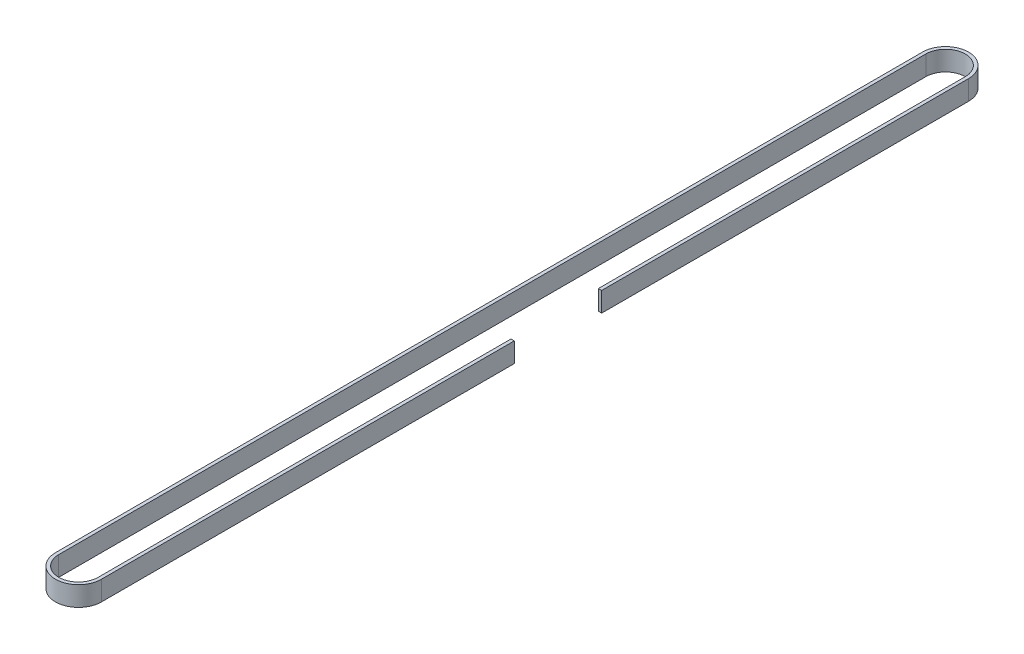
ISO-10303-21;
HEADER;
FILE_DESCRIPTION(('STEP AP214'),'2;1');
FILE_NAME('part.step','',(''),(''),'','','');
FILE_SCHEMA(('AUTOMOTIVE_DESIGN { 1 0 10303 214 1 1 1 1 }'));
ENDSEC;
DATA;
#1=APPLICATION_CONTEXT('core data for automotive mechanical design processes');
#2=APPLICATION_PROTOCOL_DEFINITION('international standard','automotive_design',2000,#1);
#3=PRODUCT_CONTEXT('',#1,'mechanical');
#4=PRODUCT('Part','Part','',(#3));
#5=PRODUCT_RELATED_PRODUCT_CATEGORY('part','',(#4));
#6=PRODUCT_DEFINITION_FORMATION('','',#4);
#7=PRODUCT_DEFINITION_CONTEXT('part definition',#1,'design');
#8=PRODUCT_DEFINITION('design','',#6,#7);
#9=PRODUCT_DEFINITION_SHAPE('','',#8);
#10=(LENGTH_UNIT() NAMED_UNIT(*) SI_UNIT(.MILLI.,.METRE.));
#11=(NAMED_UNIT(*) PLANE_ANGLE_UNIT() SI_UNIT($,.RADIAN.));
#12=(NAMED_UNIT(*) SI_UNIT($,.STERADIAN.) SOLID_ANGLE_UNIT());
#13=UNCERTAINTY_MEASURE_WITH_UNIT(LENGTH_MEASURE(1.E-05),#10,'distance_accuracy_value','');
#14=(GEOMETRIC_REPRESENTATION_CONTEXT(3) GLOBAL_UNCERTAINTY_ASSIGNED_CONTEXT((#13)) GLOBAL_UNIT_ASSIGNED_CONTEXT((#10,
#11,#12)) REPRESENTATION_CONTEXT('',''));
#15=CARTESIAN_POINT('',(0.,0.,0.));
#16=DIRECTION('',(0.,0.,1.));
#17=DIRECTION('',(1.,0.,0.));
#18=AXIS2_PLACEMENT_3D('',#15,#16,#17);
#19=CARTESIAN_POINT('',(8.6636512167587E-13,6.,125.));
#20=DIRECTION('',(0.,-1.,0.));
#21=DIRECTION('',(0.,0.,-1.));
#22=AXIS2_PLACEMENT_3D('',#19,#20,#21);
#23=CYLINDRICAL_SURFACE('',#22,6.00000000000004);
#24=CARTESIAN_POINT('',(8.6636512167587E-13,0.,125.));
#25=DIRECTION('',(0.,-1.,0.));
#26=DIRECTION('',(0.,0.,-1.));
#27=AXIS2_PLACEMENT_3D('',#24,#25,#26);
#28=CIRCLE('',#27,6.00000000000004);
#29=CARTESIAN_POINT('',(6.00000000000085,0.,125.));
#30=VERTEX_POINT('',#29);
#31=CARTESIAN_POINT('',(-5.99999999999923,0.,125.));
#32=VERTEX_POINT('',#31);
#33=EDGE_CURVE('E157',#30,#32,#28,.T.);
#34=ORIENTED_EDGE('',*,*,#33,.T.);
#35=DIRECTION('',(0.,-1.,0.));
#36=VECTOR('',#35,1.);
#37=CARTESIAN_POINT('',(-5.99999999999923,6.,125.));
#38=LINE('',#37,#36);
#39=CARTESIAN_POINT('',(-5.99999999999923,6.,125.));
#40=VERTEX_POINT('',#39);
#41=EDGE_CURVE('E11',#40,#32,#38,.T.);
#42=ORIENTED_EDGE('',*,*,#41,.F.);
#43=CARTESIAN_POINT('',(8.6636512167587E-13,6.,125.));
#44=DIRECTION('',(0.,-1.,0.));
#45=DIRECTION('',(0.,0.,-1.));
#46=AXIS2_PLACEMENT_3D('',#43,#44,#45);
#47=CIRCLE('',#46,6.00000000000004);
#48=CARTESIAN_POINT('',(6.00000000000085,6.,125.));
#49=VERTEX_POINT('',#48);
#50=EDGE_CURVE('E179',#49,#40,#47,.T.);
#51=ORIENTED_EDGE('',*,*,#50,.F.);
#52=DIRECTION('',(0.,-1.,0.));
#53=VECTOR('',#52,1.);
#54=CARTESIAN_POINT('',(6.00000000000085,6.,125.));
#55=LINE('',#54,#53);
#56=EDGE_CURVE('E153',#49,#30,#55,.T.);
#57=ORIENTED_EDGE('',*,*,#56,.T.);
#58=EDGE_LOOP('',(#34,#42,#51,#57));
#59=FACE_BOUND('',#58,.T.);
#60=ADVANCED_FACE('F37',(#59),#23,.F.);
#61=CARTESIAN_POINT('',(-5.99999999999923,6.,125.));
#62=DIRECTION('',(-1.,0.,0.));
#63=DIRECTION('',(0.,0.,1.));
#64=AXIS2_PLACEMENT_3D('',#61,#62,#63);
#65=PLANE('',#64);
#66=DIRECTION('',(0.,0.,-1.));
#67=VECTOR('',#66,1.);
#68=CARTESIAN_POINT('',(-5.99999999999923,0.,125.));
#69=LINE('',#68,#67);
#70=CARTESIAN_POINT('',(-5.99999999999923,0.,-139.));
#71=VERTEX_POINT('',#70);
#72=EDGE_CURVE('E160',#32,#71,#69,.T.);
#73=ORIENTED_EDGE('',*,*,#72,.T.);
#74=DIRECTION('',(0.,-1.,0.));
#75=VECTOR('',#74,1.);
#76=CARTESIAN_POINT('',(-5.99999999999923,6.,-139.));
#77=LINE('',#76,#75);
#78=CARTESIAN_POINT('',(-5.99999999999923,6.,-139.));
#79=VERTEX_POINT('',#78);
#80=EDGE_CURVE('E45',#79,#71,#77,.T.);
#81=ORIENTED_EDGE('',*,*,#80,.F.);
#82=DIRECTION('',(0.,0.,-1.));
#83=VECTOR('',#82,1.);
#84=CARTESIAN_POINT('',(-5.99999999999923,6.,125.));
#85=LINE('',#84,#83);
#86=EDGE_CURVE('E108',#40,#79,#85,.T.);
#87=ORIENTED_EDGE('',*,*,#86,.F.);
#88=ORIENTED_EDGE('',*,*,#41,.T.);
#89=EDGE_LOOP('',(#73,#81,#87,#88));
#90=FACE_BOUND('',#89,.T.);
#91=ADVANCED_FACE('F257',(#90),#65,.F.);
#92=CARTESIAN_POINT('',(7.73686670285656E-13,6.,-139.));
#93=DIRECTION('',(0.,-1.,0.));
#94=DIRECTION('',(0.,0.,-1.));
#95=AXIS2_PLACEMENT_3D('',#92,#93,#94);
#96=CYLINDRICAL_SURFACE('',#95,6.);
#97=CARTESIAN_POINT('',(7.73686670285656E-13,0.,-139.));
#98=DIRECTION('',(0.,-1.,0.));
#99=DIRECTION('',(0.,0.,-1.));
#100=AXIS2_PLACEMENT_3D('',#97,#98,#99);
#101=CIRCLE('',#100,6.);
#102=CARTESIAN_POINT('',(6.00000000000077,0.,-139.));
#103=VERTEX_POINT('',#102);
#104=EDGE_CURVE('E162',#71,#103,#101,.T.);
#105=ORIENTED_EDGE('',*,*,#104,.T.);
#106=DIRECTION('',(0.,-1.,0.));
#107=VECTOR('',#106,1.);
#108=CARTESIAN_POINT('',(6.00000000000077,6.,-139.));
#109=LINE('',#108,#107);
#110=CARTESIAN_POINT('',(6.00000000000077,6.,-139.));
#111=VERTEX_POINT('',#110);
#112=EDGE_CURVE('E198',#111,#103,#109,.T.);
#113=ORIENTED_EDGE('',*,*,#112,.F.);
#114=CARTESIAN_POINT('',(7.73686670285656E-13,6.,-139.));
#115=DIRECTION('',(0.,-1.,0.));
#116=DIRECTION('',(0.,0.,-1.));
#117=AXIS2_PLACEMENT_3D('',#114,#115,#116);
#118=CIRCLE('',#117,6.);
#119=EDGE_CURVE('E206',#79,#111,#118,.T.);
#120=ORIENTED_EDGE('',*,*,#119,.F.);
#121=ORIENTED_EDGE('',*,*,#80,.T.);
#122=EDGE_LOOP('',(#105,#113,#120,#121));
#123=FACE_BOUND('',#122,.T.);
#124=ADVANCED_FACE('F204',(#123),#96,.F.);
#125=CARTESIAN_POINT('',(6.00000000000081,6.,-27.3044957830456));
#126=DIRECTION('',(1.,0.,0.));
#127=DIRECTION('',(0.,0.,-1.));
#128=AXIS2_PLACEMENT_3D('',#125,#126,#127);
#129=PLANE('',#128);
#130=DIRECTION('',(0.,0.,1.));
#131=VECTOR('',#130,1.);
#132=CARTESIAN_POINT('',(6.00000000000081,0.,-27.3044957830456));
#133=LINE('',#132,#131);
#134=CARTESIAN_POINT('',(6.00000000000081,0.,-27.3044957830456));
#135=VERTEX_POINT('',#134);
#136=EDGE_CURVE('E164',#103,#135,#133,.T.);
#137=ORIENTED_EDGE('',*,*,#136,.T.);
#138=DIRECTION('',(0.,-1.,0.));
#139=VECTOR('',#138,1.);
#140=CARTESIAN_POINT('',(6.00000000000081,6.,-27.3044957830456));
#141=LINE('',#140,#139);
#142=CARTESIAN_POINT('',(6.00000000000081,6.,-27.3044957830456));
#143=VERTEX_POINT('',#142);
#144=EDGE_CURVE('E195',#143,#135,#141,.T.);
#145=ORIENTED_EDGE('',*,*,#144,.F.);
#146=DIRECTION('',(0.,0.,1.));
#147=VECTOR('',#146,1.);
#148=CARTESIAN_POINT('',(6.00000000000081,6.,-27.3044957830456));
#149=LINE('',#148,#147);
#150=EDGE_CURVE('E224',#111,#143,#149,.T.);
#151=ORIENTED_EDGE('',*,*,#150,.F.);
#152=ORIENTED_EDGE('',*,*,#112,.T.);
#153=EDGE_LOOP('',(#137,#145,#151,#152));
#154=FACE_BOUND('',#153,.T.);
#155=ADVANCED_FACE('F215',(#154),#129,.F.);
#156=CARTESIAN_POINT('',(7.00000000000153,6.,-27.3044957830456));
#157=DIRECTION('',(0.,0.,-1.));
#158=DIRECTION('',(-1.,0.,0.));
#159=AXIS2_PLACEMENT_3D('',#156,#157,#158);
#160=PLANE('',#159);
#161=DIRECTION('',(1.,0.,0.));
#162=VECTOR('',#161,1.);
#163=CARTESIAN_POINT('',(7.00000000000153,0.,-27.3044957830456));
#164=LINE('',#163,#162);
#165=CARTESIAN_POINT('',(7.00000000000153,0.,-27.3044957830456));
#166=VERTEX_POINT('',#165);
#167=EDGE_CURVE('E166',#135,#166,#164,.T.);
#168=ORIENTED_EDGE('',*,*,#167,.T.);
#169=DIRECTION('',(0.,-1.,0.));
#170=VECTOR('',#169,1.);
#171=CARTESIAN_POINT('',(7.00000000000153,6.,-27.3044957830456));
#172=LINE('',#171,#170);
#173=CARTESIAN_POINT('',(7.00000000000153,6.,-27.3044957830456));
#174=VERTEX_POINT('',#173);
#175=EDGE_CURVE('E192',#174,#166,#172,.T.);
#176=ORIENTED_EDGE('',*,*,#175,.F.);
#177=DIRECTION('',(1.,0.,0.));
#178=VECTOR('',#177,1.);
#179=CARTESIAN_POINT('',(7.00000000000153,6.,-27.3044957830456));
#180=LINE('',#179,#178);
#181=EDGE_CURVE('E221',#143,#174,#180,.T.);
#182=ORIENTED_EDGE('',*,*,#181,.F.);
#183=ORIENTED_EDGE('',*,*,#144,.T.);
#184=EDGE_LOOP('',(#168,#176,#182,#183));
#185=FACE_BOUND('',#184,.T.);
#186=ADVANCED_FACE('F219',(#185),#160,.F.);
#187=CARTESIAN_POINT('',(7.00000000000153,6.,-27.3044957830456));
#188=DIRECTION('',(-1.,0.,0.));
#189=DIRECTION('',(0.,0.,1.));
#190=AXIS2_PLACEMENT_3D('',#187,#188,#189);
#191=PLANE('',#190);
#192=DIRECTION('',(0.,0.,-1.));
#193=VECTOR('',#192,1.);
#194=CARTESIAN_POINT('',(7.00000000000153,0.,-27.3044957830456));
#195=LINE('',#194,#193);
#196=CARTESIAN_POINT('',(7.00000000000161,0.,-139.));
#197=VERTEX_POINT('',#196);
#198=EDGE_CURVE('E168',#166,#197,#195,.T.);
#199=ORIENTED_EDGE('',*,*,#198,.T.);
#200=DIRECTION('',(0.,-1.,0.));
#201=VECTOR('',#200,1.);
#202=CARTESIAN_POINT('',(7.00000000000161,6.,-139.));
#203=LINE('',#202,#201);
#204=CARTESIAN_POINT('',(7.00000000000161,6.,-139.));
#205=VERTEX_POINT('',#204);
#206=EDGE_CURVE('E189',#205,#197,#203,.T.);
#207=ORIENTED_EDGE('',*,*,#206,.F.);
#208=DIRECTION('',(0.,0.,-1.));
#209=VECTOR('',#208,1.);
#210=CARTESIAN_POINT('',(7.00000000000153,6.,-27.3044957830456));
#211=LINE('',#210,#209);
#212=EDGE_CURVE('E223',#174,#205,#211,.T.);
#213=ORIENTED_EDGE('',*,*,#212,.F.);
#214=ORIENTED_EDGE('',*,*,#175,.T.);
#215=EDGE_LOOP('',(#199,#207,#213,#214));
#216=FACE_BOUND('',#215,.T.);
#217=ADVANCED_FACE('F270',(#216),#191,.F.);
#218=CARTESIAN_POINT('',(1.61296249350175E-12,6.,-139.));
#219=DIRECTION('',(0.,-1.,0.));
#220=DIRECTION('',(0.,0.,-1.));
#221=AXIS2_PLACEMENT_3D('',#218,#219,#220);
#222=CYLINDRICAL_SURFACE('',#221,7.);
#223=CARTESIAN_POINT('',(1.61296249350175E-12,0.,-139.));
#224=DIRECTION('',(0.,1.,0.));
#225=DIRECTION('',(0.,0.,-1.));
#226=AXIS2_PLACEMENT_3D('',#223,#224,#225);
#227=CIRCLE('',#226,7.);
#228=CARTESIAN_POINT('',(-6.99999999999839,0.,-139.));
#229=VERTEX_POINT('',#228);
#230=EDGE_CURVE('E170',#197,#229,#227,.T.);
#231=ORIENTED_EDGE('',*,*,#230,.T.);
#232=DIRECTION('',(0.,-1.,0.));
#233=VECTOR('',#232,1.);
#234=CARTESIAN_POINT('',(-6.99999999999839,6.,-139.));
#235=LINE('',#234,#233);
#236=CARTESIAN_POINT('',(-6.99999999999839,6.,-139.));
#237=VERTEX_POINT('',#236);
#238=EDGE_CURVE('E186',#237,#229,#235,.T.);
#239=ORIENTED_EDGE('',*,*,#238,.F.);
#240=CARTESIAN_POINT('',(1.61296249350175E-12,6.,-139.));
#241=DIRECTION('',(0.,1.,0.));
#242=DIRECTION('',(0.,0.,-1.));
#243=AXIS2_PLACEMENT_3D('',#240,#241,#242);
#244=CIRCLE('',#243,7.);
#245=EDGE_CURVE('E226',#205,#237,#244,.T.);
#246=ORIENTED_EDGE('',*,*,#245,.F.);
#247=ORIENTED_EDGE('',*,*,#206,.T.);
#248=EDGE_LOOP('',(#231,#239,#246,#247));
#249=FACE_BOUND('',#248,.T.);
#250=ADVANCED_FACE('F273',(#249),#222,.T.);
#251=CARTESIAN_POINT('',(-6.99999999999839,6.,125.));
#252=DIRECTION('',(1.,0.,0.));
#253=DIRECTION('',(0.,0.,-1.));
#254=AXIS2_PLACEMENT_3D('',#251,#252,#253);
#255=PLANE('',#254);
#256=DIRECTION('',(0.,0.,1.));
#257=VECTOR('',#256,1.);
#258=CARTESIAN_POINT('',(-6.99999999999839,0.,125.));
#259=LINE('',#258,#257);
#260=CARTESIAN_POINT('',(-6.99999999999839,0.,125.));
#261=VERTEX_POINT('',#260);
#262=EDGE_CURVE('E172',#229,#261,#259,.T.);
#263=ORIENTED_EDGE('',*,*,#262,.T.);
#264=DIRECTION('',(0.,-1.,0.));
#265=VECTOR('',#264,1.);
#266=CARTESIAN_POINT('',(-6.99999999999839,6.,125.));
#267=LINE('',#266,#265);
#268=CARTESIAN_POINT('',(-6.99999999999839,6.,125.));
#269=VERTEX_POINT('',#268);
#270=EDGE_CURVE('E183',#269,#261,#267,.T.);
#271=ORIENTED_EDGE('',*,*,#270,.F.);
#272=DIRECTION('',(0.,0.,1.));
#273=VECTOR('',#272,1.);
#274=CARTESIAN_POINT('',(-6.99999999999839,6.,125.));
#275=LINE('',#274,#273);
#276=EDGE_CURVE('E232',#237,#269,#275,.T.);
#277=ORIENTED_EDGE('',*,*,#276,.F.);
#278=ORIENTED_EDGE('',*,*,#238,.T.);
#279=EDGE_LOOP('',(#263,#271,#277,#278));
#280=FACE_BOUND('',#279,.T.);
#281=ADVANCED_FACE('F238',(#280),#255,.F.);
#282=CARTESIAN_POINT('',(1.61328222551132E-12,6.,125.));
#283=DIRECTION('',(0.,-1.,0.));
#284=DIRECTION('',(0.,0.,-1.));
#285=AXIS2_PLACEMENT_3D('',#282,#283,#284);
#286=CYLINDRICAL_SURFACE('',#285,7.);
#287=CARTESIAN_POINT('',(1.61328222551132E-12,0.,125.));
#288=DIRECTION('',(0.,1.,0.));
#289=DIRECTION('',(0.,0.,-1.));
#290=AXIS2_PLACEMENT_3D('',#287,#288,#289);
#291=CIRCLE('',#290,7.);
#292=CARTESIAN_POINT('',(7.00000000000161,0.,125.));
#293=VERTEX_POINT('',#292);
#294=EDGE_CURVE('E174',#261,#293,#291,.T.);
#295=ORIENTED_EDGE('',*,*,#294,.T.);
#296=DIRECTION('',(0.,-1.,0.));
#297=VECTOR('',#296,1.);
#298=CARTESIAN_POINT('',(7.00000000000161,6.,125.));
#299=LINE('',#298,#297);
#300=CARTESIAN_POINT('',(7.00000000000161,6.,125.));
#301=VERTEX_POINT('',#300);
#302=EDGE_CURVE('E148',#301,#293,#299,.T.);
#303=ORIENTED_EDGE('',*,*,#302,.F.);
#304=CARTESIAN_POINT('',(1.61328222551132E-12,6.,125.));
#305=DIRECTION('',(0.,1.,0.));
#306=DIRECTION('',(0.,0.,-1.));
#307=AXIS2_PLACEMENT_3D('',#304,#305,#306);
#308=CIRCLE('',#307,7.);
#309=EDGE_CURVE('E139',#269,#301,#308,.T.);
#310=ORIENTED_EDGE('',*,*,#309,.F.);
#311=ORIENTED_EDGE('',*,*,#270,.T.);
#312=EDGE_LOOP('',(#295,#303,#310,#311));
#313=FACE_BOUND('',#312,.T.);
#314=ADVANCED_FACE('F242',(#313),#286,.T.);
#315=CARTESIAN_POINT('',(7.00000000000161,6.,125.));
#316=DIRECTION('',(-1.,0.,0.));
#317=DIRECTION('',(0.,0.,1.));
#318=AXIS2_PLACEMENT_3D('',#315,#316,#317);
#319=PLANE('',#318);
#320=DIRECTION('',(0.,0.,-1.));
#321=VECTOR('',#320,1.);
#322=CARTESIAN_POINT('',(7.00000000000161,0.,125.));
#323=LINE('',#322,#321);
#324=CARTESIAN_POINT('',(7.00000000000155,0.,-0.695504216954329));
#325=VERTEX_POINT('',#324);
#326=EDGE_CURVE('E147',#293,#325,#323,.T.);
#327=ORIENTED_EDGE('',*,*,#326,.T.);
#328=DIRECTION('',(0.,-1.,0.));
#329=VECTOR('',#328,1.);
#330=CARTESIAN_POINT('',(7.00000000000155,6.,-0.695504216954329));
#331=LINE('',#330,#329);
#332=CARTESIAN_POINT('',(7.00000000000155,6.,-0.695504216954329));
#333=VERTEX_POINT('',#332);
#334=EDGE_CURVE('E144',#333,#325,#331,.T.);
#335=ORIENTED_EDGE('',*,*,#334,.F.);
#336=DIRECTION('',(0.,0.,-1.));
#337=VECTOR('',#336,1.);
#338=CARTESIAN_POINT('',(7.00000000000161,6.,125.));
#339=LINE('',#338,#337);
#340=EDGE_CURVE('E133',#301,#333,#339,.T.);
#341=ORIENTED_EDGE('',*,*,#340,.F.);
#342=ORIENTED_EDGE('',*,*,#302,.T.);
#343=EDGE_LOOP('',(#327,#335,#341,#342));
#344=FACE_BOUND('',#343,.T.);
#345=ADVANCED_FACE('F145',(#344),#319,.F.);
#346=CARTESIAN_POINT('',(7.00000000000155,6.,-0.695504216954329));
#347=DIRECTION('',(0.,0.,1.));
#348=DIRECTION('',(1.,0.,0.));
#349=AXIS2_PLACEMENT_3D('',#346,#347,#348);
#350=PLANE('',#349);
#351=DIRECTION('',(-1.,0.,0.));
#352=VECTOR('',#351,1.);
#353=CARTESIAN_POINT('',(7.00000000000155,0.,-0.695504216954329));
#354=LINE('',#353,#352);
#355=CARTESIAN_POINT('',(6.00000000000081,0.,-0.695504216954329));
#356=VERTEX_POINT('',#355);
#357=EDGE_CURVE('E94',#325,#356,#354,.T.);
#358=ORIENTED_EDGE('',*,*,#357,.T.);
#359=DIRECTION('',(0.,-1.,0.));
#360=VECTOR('',#359,1.);
#361=CARTESIAN_POINT('',(6.00000000000081,6.,-0.695504216954329));
#362=LINE('',#361,#360);
#363=CARTESIAN_POINT('',(6.00000000000081,6.,-0.695504216954329));
#364=VERTEX_POINT('',#363);
#365=EDGE_CURVE('E149',#364,#356,#362,.T.);
#366=ORIENTED_EDGE('',*,*,#365,.F.);
#367=DIRECTION('',(-1.,0.,0.));
#368=VECTOR('',#367,1.);
#369=CARTESIAN_POINT('',(7.00000000000155,6.,-0.695504216954329));
#370=LINE('',#369,#368);
#371=EDGE_CURVE('E137',#333,#364,#370,.T.);
#372=ORIENTED_EDGE('',*,*,#371,.F.);
#373=ORIENTED_EDGE('',*,*,#334,.T.);
#374=EDGE_LOOP('',(#358,#366,#372,#373));
#375=FACE_BOUND('',#374,.T.);
#376=ADVANCED_FACE('F151',(#375),#350,.F.);
#377=CARTESIAN_POINT('',(6.00000000000085,6.,125.));
#378=DIRECTION('',(1.,0.,0.));
#379=DIRECTION('',(0.,0.,-1.));
#380=AXIS2_PLACEMENT_3D('',#377,#378,#379);
#381=PLANE('',#380);
#382=DIRECTION('',(0.,0.,1.));
#383=VECTOR('',#382,1.);
#384=CARTESIAN_POINT('',(6.00000000000085,0.,125.));
#385=LINE('',#384,#383);
#386=EDGE_CURVE('E100',#356,#30,#385,.T.);
#387=ORIENTED_EDGE('',*,*,#386,.T.);
#388=ORIENTED_EDGE('',*,*,#56,.F.);
#389=DIRECTION('',(0.,0.,1.));
#390=VECTOR('',#389,1.);
#391=CARTESIAN_POINT('',(6.00000000000085,6.,125.));
#392=LINE('',#391,#390);
#393=EDGE_CURVE('E53',#364,#49,#392,.T.);
#394=ORIENTED_EDGE('',*,*,#393,.F.);
#395=ORIENTED_EDGE('',*,*,#365,.T.);
#396=EDGE_LOOP('',(#387,#388,#394,#395));
#397=FACE_BOUND('',#396,.T.);
#398=ADVANCED_FACE('F246',(#397),#381,.F.);
#399=CARTESIAN_POINT('',(8.6636512167587E-13,6.,125.));
#400=DIRECTION('',(0.,-1.,0.));
#401=DIRECTION('',(0.,0.,-1.));
#402=AXIS2_PLACEMENT_3D('',#399,#400,#401);
#403=PLANE('',#402);
#404=ORIENTED_EDGE('',*,*,#50,.T.);
#405=ORIENTED_EDGE('',*,*,#86,.T.);
#406=ORIENTED_EDGE('',*,*,#119,.T.);
#407=ORIENTED_EDGE('',*,*,#150,.T.);
#408=ORIENTED_EDGE('',*,*,#181,.T.);
#409=ORIENTED_EDGE('',*,*,#212,.T.);
#410=ORIENTED_EDGE('',*,*,#245,.T.);
#411=ORIENTED_EDGE('',*,*,#276,.T.);
#412=ORIENTED_EDGE('',*,*,#309,.T.);
#413=ORIENTED_EDGE('',*,*,#340,.T.);
#414=ORIENTED_EDGE('',*,*,#371,.T.);
#415=ORIENTED_EDGE('',*,*,#393,.T.);
#416=EDGE_LOOP('',(#404,#405,#406,#407,#408,#409,#410,#411,#412,#413,#414,#415));
#417=FACE_BOUND('',#416,.T.);
#418=ADVANCED_FACE('F135',(#417),#403,.F.);
#419=CARTESIAN_POINT('',(8.6636512167587E-13,0.,125.));
#420=DIRECTION('',(0.,-1.,0.));
#421=DIRECTION('',(0.,0.,-1.));
#422=AXIS2_PLACEMENT_3D('',#419,#420,#421);
#423=PLANE('',#422);
#424=ORIENTED_EDGE('',*,*,#33,.F.);
#425=ORIENTED_EDGE('',*,*,#386,.F.);
#426=ORIENTED_EDGE('',*,*,#357,.F.);
#427=ORIENTED_EDGE('',*,*,#326,.F.);
#428=ORIENTED_EDGE('',*,*,#294,.F.);
#429=ORIENTED_EDGE('',*,*,#262,.F.);
#430=ORIENTED_EDGE('',*,*,#230,.F.);
#431=ORIENTED_EDGE('',*,*,#198,.F.);
#432=ORIENTED_EDGE('',*,*,#167,.F.);
#433=ORIENTED_EDGE('',*,*,#136,.F.);
#434=ORIENTED_EDGE('',*,*,#104,.F.);
#435=ORIENTED_EDGE('',*,*,#72,.F.);
#436=EDGE_LOOP('',(#424,#425,#426,#427,#428,#429,#430,#431,#432,#433,#434,#435));
#437=FACE_BOUND('',#436,.T.);
#438=ADVANCED_FACE('F210',(#437),#423,.T.);
#439=CLOSED_SHELL('',(#60,#91,#124,#155,#186,#217,#250,#281,#314,#345,#376,#398,#418,#438));
#440=MANIFOLD_SOLID_BREP('B2',#439);
#441=ADVANCED_BREP_SHAPE_REPRESENTATION('',(#18,#440),#14);
#442=SHAPE_DEFINITION_REPRESENTATION(#9,#441);
ENDSEC;
END-ISO-10303-21;
